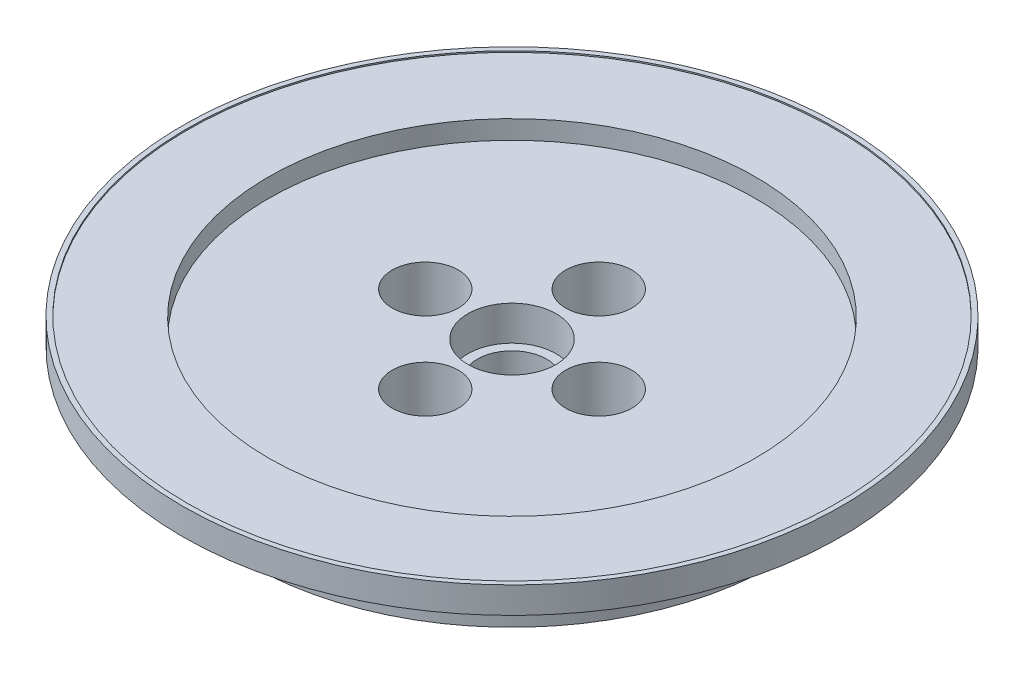
ISO-10303-21;
HEADER;
FILE_DESCRIPTION(('STEP AP214'),'2;1');
FILE_NAME('part.step','',(''),(''),'','','');
FILE_SCHEMA(('AUTOMOTIVE_DESIGN { 1 0 10303 214 1 1 1 1 }'));
ENDSEC;
DATA;
#1=APPLICATION_CONTEXT('core data for automotive mechanical design processes');
#2=APPLICATION_PROTOCOL_DEFINITION('international standard','automotive_design',2000,#1);
#3=PRODUCT_CONTEXT('',#1,'mechanical');
#4=PRODUCT('Part','Part','',(#3));
#5=PRODUCT_RELATED_PRODUCT_CATEGORY('part','',(#4));
#6=PRODUCT_DEFINITION_FORMATION('','',#4);
#7=PRODUCT_DEFINITION_CONTEXT('part definition',#1,'design');
#8=PRODUCT_DEFINITION('design','',#6,#7);
#9=PRODUCT_DEFINITION_SHAPE('','',#8);
#10=(LENGTH_UNIT() NAMED_UNIT(*) SI_UNIT(.MILLI.,.METRE.));
#11=(NAMED_UNIT(*) PLANE_ANGLE_UNIT() SI_UNIT($,.RADIAN.));
#12=(NAMED_UNIT(*) SI_UNIT($,.STERADIAN.) SOLID_ANGLE_UNIT());
#13=UNCERTAINTY_MEASURE_WITH_UNIT(LENGTH_MEASURE(1.E-05),#10,'distance_accuracy_value','');
#14=(GEOMETRIC_REPRESENTATION_CONTEXT(3) GLOBAL_UNCERTAINTY_ASSIGNED_CONTEXT((#13)) GLOBAL_UNIT_ASSIGNED_CONTEXT((#10,
#11,#12)) REPRESENTATION_CONTEXT('',''));
#15=CARTESIAN_POINT('',(0.,0.,0.));
#16=DIRECTION('',(0.,0.,1.));
#17=DIRECTION('',(1.,0.,0.));
#18=AXIS2_PLACEMENT_3D('',#15,#16,#17);
#19=CARTESIAN_POINT('',(0.,-11.938,0.));
#20=DIRECTION('',(0.,1.,0.));
#21=DIRECTION('',(0.,0.,1.));
#22=AXIS2_PLACEMENT_3D('',#19,#20,#21);
#23=CYLINDRICAL_SURFACE('',#22,38.1);
#24=CARTESIAN_POINT('',(0.,-11.938,0.));
#25=DIRECTION('',(0.,1.,0.));
#26=DIRECTION('',(0.,0.,1.));
#27=AXIS2_PLACEMENT_3D('',#24,#25,#26);
#28=CIRCLE('',#27,38.1);
#29=CARTESIAN_POINT('',(0.,-11.938,38.1));
#30=VERTEX_POINT('',#29);
#31=EDGE_CURVE('E10',#30,#30,#28,.T.);
#32=ORIENTED_EDGE('',*,*,#31,.T.);
#33=EDGE_LOOP('',(#32));
#34=FACE_BOUND('',#33,.T.);
#35=CARTESIAN_POINT('',(0.,-7.230592261634,0.));
#36=DIRECTION('',(0.,1.,0.));
#37=DIRECTION('',(0.,0.,1.));
#38=AXIS2_PLACEMENT_3D('',#35,#36,#37);
#39=CIRCLE('',#38,38.1);
#40=CARTESIAN_POINT('',(0.,-7.230592261634,38.1));
#41=VERTEX_POINT('',#40);
#42=EDGE_CURVE('E96',#41,#41,#39,.T.);
#43=ORIENTED_EDGE('',*,*,#42,.F.);
#44=EDGE_LOOP('',(#43));
#45=FACE_BOUND('',#44,.T.);
#46=ADVANCED_FACE('F32',(#34,#45),#23,.T.);
#47=CARTESIAN_POINT('',(38.1,-11.938,0.));
#48=DIRECTION('',(0.,-1.,0.));
#49=DIRECTION('',(0.,0.,-1.));
#50=AXIS2_PLACEMENT_3D('',#47,#48,#49);
#51=PLANE('',#50);
#52=CARTESIAN_POINT('',(0.,-11.938,12.5));
#53=DIRECTION('',(0.,-1.,0.));
#54=DIRECTION('',(0.,0.,-1.));
#55=AXIS2_PLACEMENT_3D('',#52,#53,#54);
#56=CIRCLE('',#55,4.76249999999999);
#57=CARTESIAN_POINT('',(0.,-11.938,7.73750000000001));
#58=VERTEX_POINT('',#57);
#59=EDGE_CURVE('E68',#58,#58,#56,.T.);
#60=ORIENTED_EDGE('',*,*,#59,.F.);
#61=EDGE_LOOP('',(#60));
#62=FACE_BOUND('',#61,.T.);
#63=CARTESIAN_POINT('',(12.5,-11.938,0.));
#64=DIRECTION('',(0.,-1.,0.));
#65=DIRECTION('',(0.,0.,-1.));
#66=AXIS2_PLACEMENT_3D('',#63,#64,#65);
#67=CIRCLE('',#66,4.76249999999999);
#68=CARTESIAN_POINT('',(12.5,-11.938,-4.76249999999999));
#69=VERTEX_POINT('',#68);
#70=EDGE_CURVE('E58',#69,#69,#67,.T.);
#71=ORIENTED_EDGE('',*,*,#70,.F.);
#72=EDGE_LOOP('',(#71));
#73=FACE_BOUND('',#72,.T.);
#74=CARTESIAN_POINT('',(0.,-11.938,-12.5));
#75=DIRECTION('',(0.,-1.,0.));
#76=DIRECTION('',(0.,0.,-1.));
#77=AXIS2_PLACEMENT_3D('',#74,#75,#76);
#78=CIRCLE('',#77,4.76249999999999);
#79=CARTESIAN_POINT('',(0.,-11.938,-17.2625));
#80=VERTEX_POINT('',#79);
#81=EDGE_CURVE('E55',#80,#80,#78,.T.);
#82=ORIENTED_EDGE('',*,*,#81,.F.);
#83=EDGE_LOOP('',(#82));
#84=FACE_BOUND('',#83,.T.);
#85=CARTESIAN_POINT('',(-12.5,-11.938,0.));
#86=DIRECTION('',(0.,-1.,0.));
#87=DIRECTION('',(0.,0.,-1.));
#88=AXIS2_PLACEMENT_3D('',#85,#86,#87);
#89=CIRCLE('',#88,4.76249999999999);
#90=CARTESIAN_POINT('',(-12.5,-11.938,-4.76249999999999));
#91=VERTEX_POINT('',#90);
#92=EDGE_CURVE('E52',#91,#91,#89,.T.);
#93=ORIENTED_EDGE('',*,*,#92,.F.);
#94=EDGE_LOOP('',(#93));
#95=FACE_BOUND('',#94,.T.);
#96=CARTESIAN_POINT('',(0.,-11.938,0.));
#97=DIRECTION('',(0.,1.,0.));
#98=DIRECTION('',(0.,0.,1.));
#99=AXIS2_PLACEMENT_3D('',#96,#97,#98);
#100=CIRCLE('',#99,5.);
#101=CARTESIAN_POINT('',(0.,-11.938,5.));
#102=VERTEX_POINT('',#101);
#103=EDGE_CURVE('E93',#102,#102,#100,.T.);
#104=ORIENTED_EDGE('',*,*,#103,.T.);
#105=EDGE_LOOP('',(#104));
#106=FACE_BOUND('',#105,.T.);
#107=ORIENTED_EDGE('',*,*,#31,.F.);
#108=EDGE_LOOP('',(#107));
#109=FACE_BOUND('',#108,.T.);
#110=ADVANCED_FACE('F119',(#62,#73,#84,#95,#106,#109),#51,.T.);
#111=CARTESIAN_POINT('',(0.,0.,0.));
#112=DIRECTION('',(0.,1.,0.));
#113=DIRECTION('',(0.,0.,1.));
#114=AXIS2_PLACEMENT_3D('',#111,#112,#113);
#115=PLANE('',#114);
#116=CARTESIAN_POINT('',(0.,0.,0.));
#117=DIRECTION('',(0.,1.,0.));
#118=DIRECTION('',(0.,0.,1.));
#119=AXIS2_PLACEMENT_3D('',#116,#117,#118);
#120=CIRCLE('',#119,46.798);
#121=CARTESIAN_POINT('',(0.,0.,46.798));
#122=VERTEX_POINT('',#121);
#123=EDGE_CURVE('E90',#122,#122,#120,.T.);
#124=ORIENTED_EDGE('',*,*,#123,.F.);
#125=EDGE_LOOP('',(#124));
#126=FACE_BOUND('',#125,.T.);
#127=CARTESIAN_POINT('',(0.,0.,0.));
#128=DIRECTION('',(0.,1.,0.));
#129=DIRECTION('',(0.,0.,1.));
#130=AXIS2_PLACEMENT_3D('',#127,#128,#129);
#131=CIRCLE('',#130,47.498);
#132=CARTESIAN_POINT('',(0.,0.,47.498));
#133=VERTEX_POINT('',#132);
#134=EDGE_CURVE('E39',#133,#133,#131,.T.);
#135=ORIENTED_EDGE('',*,*,#134,.T.);
#136=EDGE_LOOP('',(#135));
#137=FACE_BOUND('',#136,.T.);
#138=ADVANCED_FACE('F116',(#126,#137),#115,.T.);
#139=CARTESIAN_POINT('',(0.,-11.938,0.));
#140=DIRECTION('',(0.,1.,0.));
#141=DIRECTION('',(0.,0.,1.));
#142=AXIS2_PLACEMENT_3D('',#139,#140,#141);
#143=CYLINDRICAL_SURFACE('',#142,47.4979999999998);
#144=CARTESIAN_POINT('',(0.,-3.80999999999902,0.));
#145=DIRECTION('',(0.,1.,0.));
#146=DIRECTION('',(0.,0.,1.));
#147=AXIS2_PLACEMENT_3D('',#144,#145,#146);
#148=CIRCLE('',#147,47.4979999999996);
#149=CARTESIAN_POINT('',(0.,-3.80999999999902,47.4979999999996));
#150=VERTEX_POINT('',#149);
#151=EDGE_CURVE('E44',#150,#150,#148,.T.);
#152=ORIENTED_EDGE('',*,*,#151,.T.);
#153=EDGE_LOOP('',(#152));
#154=FACE_BOUND('',#153,.T.);
#155=ORIENTED_EDGE('',*,*,#134,.F.);
#156=EDGE_LOOP('',(#155));
#157=FACE_BOUND('',#156,.T.);
#158=ADVANCED_FACE('F101',(#154,#157),#143,.T.);
#159=CARTESIAN_POINT('',(0.,-3.80999999999902,0.));
#160=DIRECTION('',(0.,1.,0.));
#161=DIRECTION('',(0.,0.,1.));
#162=AXIS2_PLACEMENT_3D('',#159,#160,#161);
#163=CONICAL_SURFACE('',#162,47.4979999999996,1.2217304763959);
#164=ORIENTED_EDGE('',*,*,#42,.T.);
#165=EDGE_LOOP('',(#164));
#166=FACE_BOUND('',#165,.T.);
#167=ORIENTED_EDGE('',*,*,#151,.F.);
#168=EDGE_LOOP('',(#167));
#169=FACE_BOUND('',#168,.T.);
#170=ADVANCED_FACE('F104',(#166,#169),#163,.T.);
#171=CARTESIAN_POINT('',(0.,-11.938,0.));
#172=DIRECTION('',(0.,1.,0.));
#173=DIRECTION('',(0.,0.,1.));
#174=AXIS2_PLACEMENT_3D('',#171,#172,#173);
#175=CYLINDRICAL_SURFACE('',#174,5.);
#176=ORIENTED_EDGE('',*,*,#103,.F.);
#177=EDGE_LOOP('',(#176));
#178=FACE_BOUND('',#177,.T.);
#179=CARTESIAN_POINT('',(0.,-7.898,0.));
#180=DIRECTION('',(0.,1.,0.));
#181=DIRECTION('',(0.,0.,1.));
#182=AXIS2_PLACEMENT_3D('',#179,#180,#181);
#183=CIRCLE('',#182,5.);
#184=CARTESIAN_POINT('',(0.,-7.898,5.));
#185=VERTEX_POINT('',#184);
#186=EDGE_CURVE('E51',#185,#185,#183,.T.);
#187=ORIENTED_EDGE('',*,*,#186,.T.);
#188=EDGE_LOOP('',(#187));
#189=FACE_BOUND('',#188,.T.);
#190=ADVANCED_FACE('F106',(#178,#189),#175,.F.);
#191=CARTESIAN_POINT('',(0.,-11.938,0.));
#192=DIRECTION('',(0.,1.,0.));
#193=DIRECTION('',(0.,0.,1.));
#194=AXIS2_PLACEMENT_3D('',#191,#192,#193);
#195=CYLINDRICAL_SURFACE('',#194,46.798);
#196=CARTESIAN_POINT('',(0.,-0.200000000000001,0.));
#197=DIRECTION('',(0.,1.,0.));
#198=DIRECTION('',(0.,0.,1.));
#199=AXIS2_PLACEMENT_3D('',#196,#197,#198);
#200=CIRCLE('',#199,46.798);
#201=CARTESIAN_POINT('',(0.,-0.200000000000001,46.798));
#202=VERTEX_POINT('',#201);
#203=EDGE_CURVE('E87',#202,#202,#200,.T.);
#204=ORIENTED_EDGE('',*,*,#203,.F.);
#205=EDGE_LOOP('',(#204));
#206=FACE_BOUND('',#205,.T.);
#207=ORIENTED_EDGE('',*,*,#123,.T.);
#208=EDGE_LOOP('',(#207));
#209=FACE_BOUND('',#208,.T.);
#210=ADVANCED_FACE('F113',(#206,#209),#195,.F.);
#211=CARTESIAN_POINT('',(46.798,-0.2,0.));
#212=DIRECTION('',(0.,-1.,0.));
#213=DIRECTION('',(0.,0.,-1.));
#214=AXIS2_PLACEMENT_3D('',#211,#212,#213);
#215=PLANE('',#214);
#216=CARTESIAN_POINT('',(0.,-0.200000000000001,0.));
#217=DIRECTION('',(0.,1.,0.));
#218=DIRECTION('',(0.,0.,1.));
#219=AXIS2_PLACEMENT_3D('',#216,#217,#218);
#220=CIRCLE('',#219,35.1);
#221=CARTESIAN_POINT('',(0.,-0.200000000000001,35.1));
#222=VERTEX_POINT('',#221);
#223=EDGE_CURVE('E84',#222,#222,#220,.T.);
#224=ORIENTED_EDGE('',*,*,#223,.F.);
#225=EDGE_LOOP('',(#224));
#226=FACE_BOUND('',#225,.T.);
#227=ORIENTED_EDGE('',*,*,#203,.T.);
#228=EDGE_LOOP('',(#227));
#229=FACE_BOUND('',#228,.T.);
#230=ADVANCED_FACE('F167',(#226,#229),#215,.F.);
#231=CARTESIAN_POINT('',(0.,-11.938,0.));
#232=DIRECTION('',(0.,1.,0.));
#233=DIRECTION('',(0.,0.,1.));
#234=AXIS2_PLACEMENT_3D('',#231,#232,#233);
#235=CYLINDRICAL_SURFACE('',#234,35.1);
#236=CARTESIAN_POINT('',(0.,-2.9,0.));
#237=DIRECTION('',(0.,1.,0.));
#238=DIRECTION('',(0.,0.,1.));
#239=AXIS2_PLACEMENT_3D('',#236,#237,#238);
#240=CIRCLE('',#239,35.1);
#241=CARTESIAN_POINT('',(0.,-2.9,35.1));
#242=VERTEX_POINT('',#241);
#243=EDGE_CURVE('E81',#242,#242,#240,.T.);
#244=ORIENTED_EDGE('',*,*,#243,.F.);
#245=EDGE_LOOP('',(#244));
#246=FACE_BOUND('',#245,.T.);
#247=ORIENTED_EDGE('',*,*,#223,.T.);
#248=EDGE_LOOP('',(#247));
#249=FACE_BOUND('',#248,.T.);
#250=ADVANCED_FACE('F160',(#246,#249),#235,.F.);
#251=CARTESIAN_POINT('',(35.1,-2.9,0.));
#252=DIRECTION('',(0.,-1.,0.));
#253=DIRECTION('',(0.,0.,-1.));
#254=AXIS2_PLACEMENT_3D('',#251,#252,#253);
#255=PLANE('',#254);
#256=CARTESIAN_POINT('',(0.,-2.9,12.5));
#257=DIRECTION('',(0.,-1.,0.));
#258=DIRECTION('',(0.,0.,-1.));
#259=AXIS2_PLACEMENT_3D('',#256,#257,#258);
#260=CIRCLE('',#259,4.76249999999999);
#261=CARTESIAN_POINT('',(0.,-2.9,7.73750000000001));
#262=VERTEX_POINT('',#261);
#263=EDGE_CURVE('E35',#262,#262,#260,.T.);
#264=ORIENTED_EDGE('',*,*,#263,.T.);
#265=EDGE_LOOP('',(#264));
#266=FACE_BOUND('',#265,.T.);
#267=CARTESIAN_POINT('',(12.5,-2.9,0.));
#268=DIRECTION('',(0.,-1.,0.));
#269=DIRECTION('',(0.,0.,-1.));
#270=AXIS2_PLACEMENT_3D('',#267,#268,#269);
#271=CIRCLE('',#270,4.76249999999999);
#272=CARTESIAN_POINT('',(12.5,-2.9,-4.76249999999999));
#273=VERTEX_POINT('',#272);
#274=EDGE_CURVE('E56',#273,#273,#271,.T.);
#275=ORIENTED_EDGE('',*,*,#274,.T.);
#276=EDGE_LOOP('',(#275));
#277=FACE_BOUND('',#276,.T.);
#278=CARTESIAN_POINT('',(0.,-2.9,-12.5));
#279=DIRECTION('',(0.,-1.,0.));
#280=DIRECTION('',(0.,0.,-1.));
#281=AXIS2_PLACEMENT_3D('',#278,#279,#280);
#282=CIRCLE('',#281,4.76249999999999);
#283=CARTESIAN_POINT('',(0.,-2.9,-17.2625));
#284=VERTEX_POINT('',#283);
#285=EDGE_CURVE('E53',#284,#284,#282,.T.);
#286=ORIENTED_EDGE('',*,*,#285,.T.);
#287=EDGE_LOOP('',(#286));
#288=FACE_BOUND('',#287,.T.);
#289=CARTESIAN_POINT('',(-12.5,-2.9,0.));
#290=DIRECTION('',(0.,-1.,0.));
#291=DIRECTION('',(0.,0.,-1.));
#292=AXIS2_PLACEMENT_3D('',#289,#290,#291);
#293=CIRCLE('',#292,4.76249999999999);
#294=CARTESIAN_POINT('',(-12.5,-2.9,-4.76249999999999));
#295=VERTEX_POINT('',#294);
#296=EDGE_CURVE('E48',#295,#295,#293,.T.);
#297=ORIENTED_EDGE('',*,*,#296,.T.);
#298=EDGE_LOOP('',(#297));
#299=FACE_BOUND('',#298,.T.);
#300=CARTESIAN_POINT('',(0.,-2.9,0.));
#301=DIRECTION('',(0.,1.,0.));
#302=DIRECTION('',(0.,0.,1.));
#303=AXIS2_PLACEMENT_3D('',#300,#301,#302);
#304=CIRCLE('',#303,6.35);
#305=CARTESIAN_POINT('',(0.,-2.9,6.35));
#306=VERTEX_POINT('',#305);
#307=EDGE_CURVE('E78',#306,#306,#304,.T.);
#308=ORIENTED_EDGE('',*,*,#307,.F.);
#309=EDGE_LOOP('',(#308));
#310=FACE_BOUND('',#309,.T.);
#311=ORIENTED_EDGE('',*,*,#243,.T.);
#312=EDGE_LOOP('',(#311));
#313=FACE_BOUND('',#312,.T.);
#314=ADVANCED_FACE('F154',(#266,#277,#288,#299,#310,#313),#255,.F.);
#315=CARTESIAN_POINT('',(0.,-11.938,0.));
#316=DIRECTION('',(0.,1.,0.));
#317=DIRECTION('',(0.,0.,1.));
#318=AXIS2_PLACEMENT_3D('',#315,#316,#317);
#319=CYLINDRICAL_SURFACE('',#318,6.35);
#320=CARTESIAN_POINT('',(0.,-7.898,0.));
#321=DIRECTION('',(0.,1.,0.));
#322=DIRECTION('',(0.,0.,1.));
#323=AXIS2_PLACEMENT_3D('',#320,#321,#322);
#324=CIRCLE('',#323,6.35);
#325=CARTESIAN_POINT('',(0.,-7.898,6.35));
#326=VERTEX_POINT('',#325);
#327=EDGE_CURVE('E75',#326,#326,#324,.T.);
#328=ORIENTED_EDGE('',*,*,#327,.F.);
#329=EDGE_LOOP('',(#328));
#330=FACE_BOUND('',#329,.T.);
#331=ORIENTED_EDGE('',*,*,#307,.T.);
#332=EDGE_LOOP('',(#331));
#333=FACE_BOUND('',#332,.T.);
#334=ADVANCED_FACE('F148',(#330,#333),#319,.F.);
#335=CARTESIAN_POINT('',(6.35,-7.898,0.));
#336=DIRECTION('',(0.,-1.,0.));
#337=DIRECTION('',(0.,0.,-1.));
#338=AXIS2_PLACEMENT_3D('',#335,#336,#337);
#339=PLANE('',#338);
#340=ORIENTED_EDGE('',*,*,#186,.F.);
#341=EDGE_LOOP('',(#340));
#342=FACE_BOUND('',#341,.T.);
#343=ORIENTED_EDGE('',*,*,#327,.T.);
#344=EDGE_LOOP('',(#343));
#345=FACE_BOUND('',#344,.T.);
#346=ADVANCED_FACE('F144',(#342,#345),#339,.F.);
#347=CARTESIAN_POINT('',(-12.5,-11.938,0.));
#348=DIRECTION('',(0.,-1.,0.));
#349=DIRECTION('',(0.,0.,-1.));
#350=AXIS2_PLACEMENT_3D('',#347,#348,#349);
#351=CYLINDRICAL_SURFACE('',#350,4.76249999999999);
#352=ORIENTED_EDGE('',*,*,#92,.T.);
#353=EDGE_LOOP('',(#352));
#354=FACE_BOUND('',#353,.T.);
#355=ORIENTED_EDGE('',*,*,#296,.F.);
#356=EDGE_LOOP('',(#355));
#357=FACE_BOUND('',#356,.T.);
#358=ADVANCED_FACE('F147',(#354,#357),#351,.F.);
#359=CARTESIAN_POINT('',(0.,-11.938,-12.5));
#360=DIRECTION('',(0.,-1.,0.));
#361=DIRECTION('',(0.,0.,-1.));
#362=AXIS2_PLACEMENT_3D('',#359,#360,#361);
#363=CYLINDRICAL_SURFACE('',#362,4.76249999999999);
#364=ORIENTED_EDGE('',*,*,#81,.T.);
#365=EDGE_LOOP('',(#364));
#366=FACE_BOUND('',#365,.T.);
#367=ORIENTED_EDGE('',*,*,#285,.F.);
#368=EDGE_LOOP('',(#367));
#369=FACE_BOUND('',#368,.T.);
#370=ADVANCED_FACE('F187',(#366,#369),#363,.F.);
#371=CARTESIAN_POINT('',(12.5,-11.938,0.));
#372=DIRECTION('',(0.,-1.,0.));
#373=DIRECTION('',(0.,0.,-1.));
#374=AXIS2_PLACEMENT_3D('',#371,#372,#373);
#375=CYLINDRICAL_SURFACE('',#374,4.76249999999999);
#376=ORIENTED_EDGE('',*,*,#70,.T.);
#377=EDGE_LOOP('',(#376));
#378=FACE_BOUND('',#377,.T.);
#379=ORIENTED_EDGE('',*,*,#274,.F.);
#380=EDGE_LOOP('',(#379));
#381=FACE_BOUND('',#380,.T.);
#382=ADVANCED_FACE('F191',(#378,#381),#375,.F.);
#383=CARTESIAN_POINT('',(0.,-11.938,12.5));
#384=DIRECTION('',(0.,-1.,0.));
#385=DIRECTION('',(0.,0.,-1.));
#386=AXIS2_PLACEMENT_3D('',#383,#384,#385);
#387=CYLINDRICAL_SURFACE('',#386,4.76249999999999);
#388=ORIENTED_EDGE('',*,*,#59,.T.);
#389=EDGE_LOOP('',(#388));
#390=FACE_BOUND('',#389,.T.);
#391=ORIENTED_EDGE('',*,*,#263,.F.);
#392=EDGE_LOOP('',(#391));
#393=FACE_BOUND('',#392,.T.);
#394=ADVANCED_FACE('F195',(#390,#393),#387,.F.);
#395=CLOSED_SHELL('',(#46,#110,#138,#158,#170,#190,#210,#230,#250,#314,#334,#346,#358,#370,#382,#394));
#396=MANIFOLD_SOLID_BREP('B2',#395);
#397=ADVANCED_BREP_SHAPE_REPRESENTATION('',(#18,#396),#14);
#398=SHAPE_DEFINITION_REPRESENTATION(#9,#397);
ENDSEC;
END-ISO-10303-21;
